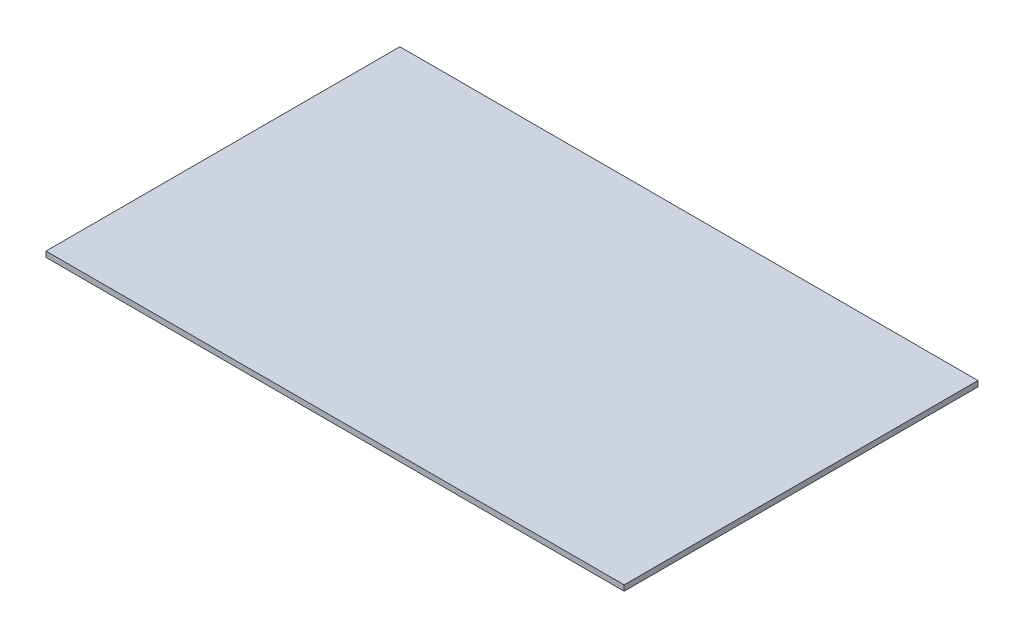
ISO-10303-21;
HEADER;
FILE_DESCRIPTION(('STEP AP214'),'2;1');
FILE_NAME('part.step','',(''),(''),'','','');
FILE_SCHEMA(('AUTOMOTIVE_DESIGN { 1 0 10303 214 1 1 1 1 }'));
ENDSEC;
DATA;
#1=APPLICATION_CONTEXT('core data for automotive mechanical design processes');
#2=APPLICATION_PROTOCOL_DEFINITION('international standard','automotive_design',2000,#1);
#3=PRODUCT_CONTEXT('',#1,'mechanical');
#4=PRODUCT('Part','Part','',(#3));
#5=PRODUCT_RELATED_PRODUCT_CATEGORY('part','',(#4));
#6=PRODUCT_DEFINITION_FORMATION('','',#4);
#7=PRODUCT_DEFINITION_CONTEXT('part definition',#1,'design');
#8=PRODUCT_DEFINITION('design','',#6,#7);
#9=PRODUCT_DEFINITION_SHAPE('','',#8);
#10=(LENGTH_UNIT() NAMED_UNIT(*) SI_UNIT(.MILLI.,.METRE.));
#11=(NAMED_UNIT(*) PLANE_ANGLE_UNIT() SI_UNIT($,.RADIAN.));
#12=(NAMED_UNIT(*) SI_UNIT($,.STERADIAN.) SOLID_ANGLE_UNIT());
#13=UNCERTAINTY_MEASURE_WITH_UNIT(LENGTH_MEASURE(1.E-05),#10,'distance_accuracy_value','');
#14=(GEOMETRIC_REPRESENTATION_CONTEXT(3) GLOBAL_UNCERTAINTY_ASSIGNED_CONTEXT((#13)) GLOBAL_UNIT_ASSIGNED_CONTEXT((#10,
#11,#12)) REPRESENTATION_CONTEXT('',''));
#15=CARTESIAN_POINT('',(0.,0.,0.));
#16=DIRECTION('',(0.,0.,1.));
#17=DIRECTION('',(1.,0.,0.));
#18=AXIS2_PLACEMENT_3D('',#15,#16,#17);
#19=CARTESIAN_POINT('',(-156.466003454862,3.,-95.7727850328695));
#20=DIRECTION('',(1.,0.,0.));
#21=DIRECTION('',(0.,0.,-1.));
#22=AXIS2_PLACEMENT_3D('',#19,#20,#21);
#23=PLANE('',#22);
#24=DIRECTION('',(0.,0.,1.));
#25=VECTOR('',#24,1.);
#26=CARTESIAN_POINT('',(-156.466003454862,0.,-95.7727850328695));
#27=LINE('',#26,#25);
#28=CARTESIAN_POINT('',(-156.466003454862,0.,-95.7727850328695));
#29=VERTEX_POINT('',#28);
#30=CARTESIAN_POINT('',(-156.466003454862,0.,95.7727850328695));
#31=VERTEX_POINT('',#30);
#32=EDGE_CURVE('E96',#29,#31,#27,.T.);
#33=ORIENTED_EDGE('',*,*,#32,.T.);
#34=DIRECTION('',(0.,-1.,0.));
#35=VECTOR('',#34,1.);
#36=CARTESIAN_POINT('',(-156.466003454862,3.,95.7727850328695));
#37=LINE('',#36,#35);
#38=CARTESIAN_POINT('',(-156.466003454862,3.,95.7727850328695));
#39=VERTEX_POINT('',#38);
#40=EDGE_CURVE('E11',#39,#31,#37,.T.);
#41=ORIENTED_EDGE('',*,*,#40,.F.);
#42=DIRECTION('',(0.,0.,1.));
#43=VECTOR('',#42,1.);
#44=CARTESIAN_POINT('',(-156.466003454862,3.,-95.7727850328695));
#45=LINE('',#44,#43);
#46=CARTESIAN_POINT('',(-156.466003454862,3.,-95.7727850328695));
#47=VERTEX_POINT('',#46);
#48=EDGE_CURVE('E82',#47,#39,#45,.T.);
#49=ORIENTED_EDGE('',*,*,#48,.F.);
#50=DIRECTION('',(0.,-1.,0.));
#51=VECTOR('',#50,1.);
#52=CARTESIAN_POINT('',(-156.466003454862,3.,-95.7727850328695));
#53=LINE('',#52,#51);
#54=EDGE_CURVE('E49',#47,#29,#53,.T.);
#55=ORIENTED_EDGE('',*,*,#54,.T.);
#56=EDGE_LOOP('',(#33,#41,#49,#55));
#57=FACE_BOUND('',#56,.T.);
#58=ADVANCED_FACE('F33',(#57),#23,.F.);
#59=CARTESIAN_POINT('',(-156.466003454862,3.,95.7727850328695));
#60=DIRECTION('',(0.,0.,-1.));
#61=DIRECTION('',(-1.,0.,0.));
#62=AXIS2_PLACEMENT_3D('',#59,#60,#61);
#63=PLANE('',#62);
#64=DIRECTION('',(1.,0.,0.));
#65=VECTOR('',#64,1.);
#66=CARTESIAN_POINT('',(-156.466003454862,0.,95.7727850328695));
#67=LINE('',#66,#65);
#68=CARTESIAN_POINT('',(156.466003454862,0.,95.7727850328695));
#69=VERTEX_POINT('',#68);
#70=EDGE_CURVE('E87',#31,#69,#67,.T.);
#71=ORIENTED_EDGE('',*,*,#70,.T.);
#72=DIRECTION('',(0.,-1.,0.));
#73=VECTOR('',#72,1.);
#74=CARTESIAN_POINT('',(156.466003454862,3.,95.7727850328695));
#75=LINE('',#74,#73);
#76=CARTESIAN_POINT('',(156.466003454862,3.,95.7727850328695));
#77=VERTEX_POINT('',#76);
#78=EDGE_CURVE('E41',#77,#69,#75,.T.);
#79=ORIENTED_EDGE('',*,*,#78,.F.);
#80=DIRECTION('',(1.,0.,0.));
#81=VECTOR('',#80,1.);
#82=CARTESIAN_POINT('',(-156.466003454862,3.,95.7727850328695));
#83=LINE('',#82,#81);
#84=EDGE_CURVE('E74',#39,#77,#83,.T.);
#85=ORIENTED_EDGE('',*,*,#84,.F.);
#86=ORIENTED_EDGE('',*,*,#40,.T.);
#87=EDGE_LOOP('',(#71,#79,#85,#86));
#88=FACE_BOUND('',#87,.T.);
#89=ADVANCED_FACE('F86',(#88),#63,.F.);
#90=CARTESIAN_POINT('',(156.466003454862,3.,-95.7727850328695));
#91=DIRECTION('',(1.,0.,0.));
#92=DIRECTION('',(0.,0.,-1.));
#93=AXIS2_PLACEMENT_3D('',#90,#91,#92);
#94=PLANE('',#93);
#95=DIRECTION('',(0.,0.,1.));
#96=VECTOR('',#95,1.);
#97=CARTESIAN_POINT('',(156.466003454862,0.,-95.7727850328695));
#98=LINE('',#97,#96);
#99=CARTESIAN_POINT('',(156.466003454862,0.,-95.7727850328695));
#100=VERTEX_POINT('',#99);
#101=EDGE_CURVE('E99',#100,#69,#98,.T.);
#102=ORIENTED_EDGE('',*,*,#101,.F.);
#103=DIRECTION('',(0.,-1.,0.));
#104=VECTOR('',#103,1.);
#105=CARTESIAN_POINT('',(156.466003454862,3.,-95.7727850328695));
#106=LINE('',#105,#104);
#107=CARTESIAN_POINT('',(156.466003454862,3.,-95.7727850328695));
#108=VERTEX_POINT('',#107);
#109=EDGE_CURVE('E63',#108,#100,#106,.T.);
#110=ORIENTED_EDGE('',*,*,#109,.F.);
#111=DIRECTION('',(0.,0.,1.));
#112=VECTOR('',#111,1.);
#113=CARTESIAN_POINT('',(156.466003454862,3.,-95.7727850328695));
#114=LINE('',#113,#112);
#115=EDGE_CURVE('E81',#108,#77,#114,.T.);
#116=ORIENTED_EDGE('',*,*,#115,.T.);
#117=ORIENTED_EDGE('',*,*,#78,.T.);
#118=EDGE_LOOP('',(#102,#110,#116,#117));
#119=FACE_BOUND('',#118,.T.);
#120=ADVANCED_FACE('F90',(#119),#94,.T.);
#121=CARTESIAN_POINT('',(-156.466003454862,3.,-95.7727850328695));
#122=DIRECTION('',(0.,0.,-1.));
#123=DIRECTION('',(-1.,0.,0.));
#124=AXIS2_PLACEMENT_3D('',#121,#122,#123);
#125=PLANE('',#124);
#126=DIRECTION('',(1.,0.,0.));
#127=VECTOR('',#126,1.);
#128=CARTESIAN_POINT('',(-156.466003454862,0.,-95.7727850328695));
#129=LINE('',#128,#127);
#130=EDGE_CURVE('E101',#29,#100,#129,.T.);
#131=ORIENTED_EDGE('',*,*,#130,.F.);
#132=ORIENTED_EDGE('',*,*,#54,.F.);
#133=DIRECTION('',(1.,0.,0.));
#134=VECTOR('',#133,1.);
#135=CARTESIAN_POINT('',(-156.466003454862,3.,-95.7727850328695));
#136=LINE('',#135,#134);
#137=EDGE_CURVE('E91',#47,#108,#136,.T.);
#138=ORIENTED_EDGE('',*,*,#137,.T.);
#139=ORIENTED_EDGE('',*,*,#109,.T.);
#140=EDGE_LOOP('',(#131,#132,#138,#139));
#141=FACE_BOUND('',#140,.T.);
#142=ADVANCED_FACE('F107',(#141),#125,.T.);
#143=CARTESIAN_POINT('',(0.,3.,0.));
#144=DIRECTION('',(0.,1.,0.));
#145=DIRECTION('',(0.,0.,1.));
#146=AXIS2_PLACEMENT_3D('',#143,#144,#145);
#147=PLANE('',#146);
#148=ORIENTED_EDGE('',*,*,#48,.T.);
#149=ORIENTED_EDGE('',*,*,#84,.T.);
#150=ORIENTED_EDGE('',*,*,#115,.F.);
#151=ORIENTED_EDGE('',*,*,#137,.F.);
#152=EDGE_LOOP('',(#148,#149,#150,#151));
#153=FACE_BOUND('',#152,.T.);
#154=ADVANCED_FACE('F78',(#153),#147,.T.);
#155=CARTESIAN_POINT('',(0.,0.,0.));
#156=DIRECTION('',(0.,1.,0.));
#157=DIRECTION('',(0.,0.,1.));
#158=AXIS2_PLACEMENT_3D('',#155,#156,#157);
#159=PLANE('',#158);
#160=ORIENTED_EDGE('',*,*,#32,.F.);
#161=ORIENTED_EDGE('',*,*,#130,.T.);
#162=ORIENTED_EDGE('',*,*,#101,.T.);
#163=ORIENTED_EDGE('',*,*,#70,.F.);
#164=EDGE_LOOP('',(#160,#161,#162,#163));
#165=FACE_BOUND('',#164,.T.);
#166=ADVANCED_FACE('F106',(#165),#159,.F.);
#167=CLOSED_SHELL('',(#58,#89,#120,#142,#154,#166));
#168=MANIFOLD_SOLID_BREP('B2',#167);
#169=ADVANCED_BREP_SHAPE_REPRESENTATION('',(#18,#168),#14);
#170=SHAPE_DEFINITION_REPRESENTATION(#9,#169);
ENDSEC;
END-ISO-10303-21;
